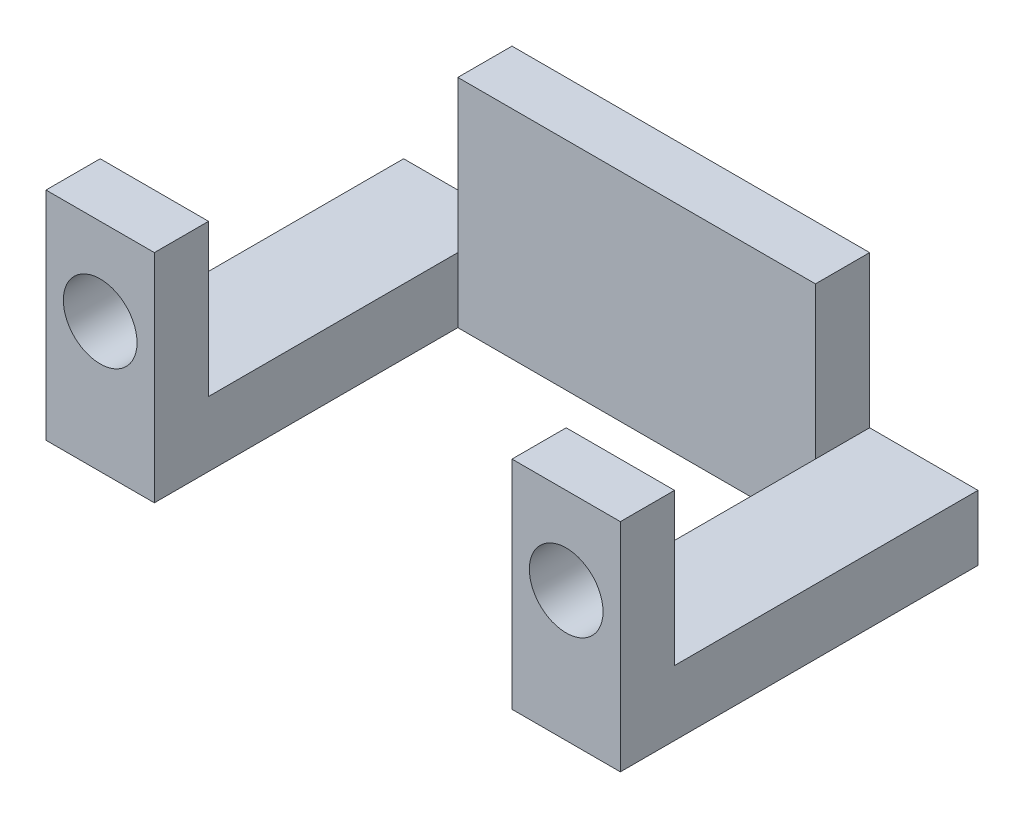
ISO-10303-21;
HEADER;
FILE_DESCRIPTION(('STEP AP214'),'2;1');
FILE_NAME('part.step','',(''),(''),'','','');
FILE_SCHEMA(('AUTOMOTIVE_DESIGN { 1 0 10303 214 1 1 1 1 }'));
ENDSEC;
DATA;
#1=APPLICATION_CONTEXT('core data for automotive mechanical design processes');
#2=APPLICATION_PROTOCOL_DEFINITION('international standard','automotive_design',2000,#1);
#3=PRODUCT_CONTEXT('',#1,'mechanical');
#4=PRODUCT('Part','Part','',(#3));
#5=PRODUCT_RELATED_PRODUCT_CATEGORY('part','',(#4));
#6=PRODUCT_DEFINITION_FORMATION('','',#4);
#7=PRODUCT_DEFINITION_CONTEXT('part definition',#1,'design');
#8=PRODUCT_DEFINITION('design','',#6,#7);
#9=PRODUCT_DEFINITION_SHAPE('','',#8);
#10=(LENGTH_UNIT() NAMED_UNIT(*) SI_UNIT(.MILLI.,.METRE.));
#11=(NAMED_UNIT(*) PLANE_ANGLE_UNIT() SI_UNIT($,.RADIAN.));
#12=(NAMED_UNIT(*) SI_UNIT($,.STERADIAN.) SOLID_ANGLE_UNIT());
#13=UNCERTAINTY_MEASURE_WITH_UNIT(LENGTH_MEASURE(1.E-05),#10,'distance_accuracy_value','');
#14=(GEOMETRIC_REPRESENTATION_CONTEXT(3) GLOBAL_UNCERTAINTY_ASSIGNED_CONTEXT((#13)) GLOBAL_UNIT_ASSIGNED_CONTEXT((#10,
#11,#12)) REPRESENTATION_CONTEXT('',''));
#15=CARTESIAN_POINT('',(0.,0.,0.));
#16=DIRECTION('',(0.,0.,1.));
#17=DIRECTION('',(1.,0.,0.));
#18=AXIS2_PLACEMENT_3D('',#15,#16,#17);
#19=CARTESIAN_POINT('',(0.,-360.42609669656,33.));
#20=DIRECTION('',(0.,1.,0.));
#21=DIRECTION('',(0.,0.,1.));
#22=AXIS2_PLACEMENT_3D('',#19,#20,#21);
#23=PLANE('',#22);
#24=DIRECTION('',(0.,0.,-1.));
#25=VECTOR('',#24,1.);
#26=CARTESIAN_POINT('',(-628.742256660427,-360.42609669656,33.));
#27=LINE('',#26,#25);
#28=CARTESIAN_POINT('',(-628.742256660427,-360.42609669656,28.));
#29=VERTEX_POINT('',#28);
#30=CARTESIAN_POINT('',(-628.742256660427,-360.42609669656,5.));
#31=VERTEX_POINT('',#30);
#32=EDGE_CURVE('E66',#29,#31,#27,.T.);
#33=ORIENTED_EDGE('',*,*,#32,.F.);
#34=DIRECTION('',(1.,0.,0.));
#35=VECTOR('',#34,1.);
#36=CARTESIAN_POINT('',(0.,-360.42609669656,28.));
#37=LINE('',#36,#35);
#38=CARTESIAN_POINT('',(-618.742256660427,-360.42609669656,28.));
#39=VERTEX_POINT('',#38);
#40=EDGE_CURVE('E70',#29,#39,#37,.T.);
#41=ORIENTED_EDGE('',*,*,#40,.T.);
#42=DIRECTION('',(0.,0.,-1.));
#43=VECTOR('',#42,1.);
#44=CARTESIAN_POINT('',(-618.742256660427,-360.42609669656,33.));
#45=LINE('',#44,#43);
#46=CARTESIAN_POINT('',(-618.742256660427,-360.42609669656,0.));
#47=VERTEX_POINT('',#46);
#48=EDGE_CURVE('E164',#39,#47,#45,.T.);
#49=ORIENTED_EDGE('',*,*,#48,.T.);
#50=DIRECTION('',(1.,0.,0.));
#51=VECTOR('',#50,1.);
#52=CARTESIAN_POINT('',(0.,-360.42609669656,0.));
#53=LINE('',#52,#51);
#54=CARTESIAN_POINT('',(-628.742256660427,-360.42609669656,0.));
#55=VERTEX_POINT('',#54);
#56=EDGE_CURVE('E253',#55,#47,#53,.T.);
#57=ORIENTED_EDGE('',*,*,#56,.F.);
#58=EDGE_CURVE('E57',#31,#55,#27,.T.);
#59=ORIENTED_EDGE('',*,*,#58,.F.);
#60=EDGE_LOOP('',(#33,#41,#49,#57,#59));
#61=FACE_BOUND('',#60,.T.);
#62=ADVANCED_FACE('F47',(#61),#23,.T.);
#63=CARTESIAN_POINT('',(0.,-360.42609669656,33.));
#64=DIRECTION('',(0.,1.,0.));
#65=DIRECTION('',(0.,0.,1.));
#66=AXIS2_PLACEMENT_3D('',#63,#64,#65);
#67=PLANE('',#66);
#68=DIRECTION('',(0.,0.,-1.));
#69=VECTOR('',#68,1.);
#70=CARTESIAN_POINT('',(-671.742256660427,-360.42609669656,33.));
#71=LINE('',#70,#69);
#72=CARTESIAN_POINT('',(-671.742256660427,-360.42609669656,28.));
#73=VERTEX_POINT('',#72);
#74=CARTESIAN_POINT('',(-671.742256660427,-360.42609669656,0.));
#75=VERTEX_POINT('',#74);
#76=EDGE_CURVE('E250',#73,#75,#71,.T.);
#77=ORIENTED_EDGE('',*,*,#76,.F.);
#78=DIRECTION('',(1.,0.,0.));
#79=VECTOR('',#78,1.);
#80=CARTESIAN_POINT('',(0.,-360.42609669656,28.));
#81=LINE('',#80,#79);
#82=CARTESIAN_POINT('',(-661.742256660427,-360.42609669656,28.));
#83=VERTEX_POINT('',#82);
#84=EDGE_CURVE('E198',#73,#83,#81,.T.);
#85=ORIENTED_EDGE('',*,*,#84,.T.);
#86=DIRECTION('',(0.,0.,-1.));
#87=VECTOR('',#86,1.);
#88=CARTESIAN_POINT('',(-661.742256660427,-360.42609669656,33.));
#89=LINE('',#88,#87);
#90=CARTESIAN_POINT('',(-661.742256660427,-360.42609669656,5.));
#91=VERTEX_POINT('',#90);
#92=EDGE_CURVE('E59',#83,#91,#89,.T.);
#93=ORIENTED_EDGE('',*,*,#92,.T.);
#94=CARTESIAN_POINT('',(-661.742256660427,-360.42609669656,0.));
#95=VERTEX_POINT('',#94);
#96=EDGE_CURVE('E11',#91,#95,#89,.T.);
#97=ORIENTED_EDGE('',*,*,#96,.T.);
#98=DIRECTION('',(1.,0.,0.));
#99=VECTOR('',#98,1.);
#100=CARTESIAN_POINT('',(0.,-360.42609669656,0.));
#101=LINE('',#100,#99);
#102=EDGE_CURVE('E220',#75,#95,#101,.T.);
#103=ORIENTED_EDGE('',*,*,#102,.F.);
#104=EDGE_LOOP('',(#77,#85,#93,#97,#103));
#105=FACE_BOUND('',#104,.T.);
#106=ADVANCED_FACE('F361',(#105),#67,.T.);
#107=CARTESIAN_POINT('',(-661.742256660427,0.,5.));
#108=DIRECTION('',(1.,0.,0.));
#109=DIRECTION('',(0.,0.,-1.));
#110=AXIS2_PLACEMENT_3D('',#107,#108,#109);
#111=PLANE('',#110);
#112=ORIENTED_EDGE('',*,*,#96,.F.);
#113=DIRECTION('',(0.,-1.,0.));
#114=VECTOR('',#113,1.);
#115=CARTESIAN_POINT('',(-661.742256660427,0.,5.));
#116=LINE('',#115,#114);
#117=CARTESIAN_POINT('',(-661.742256660427,-346.42609669656,5.));
#118=VERTEX_POINT('',#117);
#119=EDGE_CURVE('E293',#118,#91,#116,.T.);
#120=ORIENTED_EDGE('',*,*,#119,.F.);
#121=DIRECTION('',(0.,0.,-1.));
#122=VECTOR('',#121,1.);
#123=CARTESIAN_POINT('',(-661.742256660427,-346.42609669656,5.));
#124=LINE('',#123,#122);
#125=CARTESIAN_POINT('',(-661.742256660427,-346.42609669656,0.));
#126=VERTEX_POINT('',#125);
#127=EDGE_CURVE('E301',#118,#126,#124,.T.);
#128=ORIENTED_EDGE('',*,*,#127,.T.);
#129=DIRECTION('',(0.,-1.,0.));
#130=VECTOR('',#129,1.);
#131=CARTESIAN_POINT('',(-661.742256660427,0.,0.));
#132=LINE('',#131,#130);
#133=EDGE_CURVE('E309',#126,#95,#132,.T.);
#134=ORIENTED_EDGE('',*,*,#133,.T.);
#135=EDGE_LOOP('',(#112,#120,#128,#134));
#136=FACE_BOUND('',#135,.T.);
#137=ADVANCED_FACE('F332',(#136),#111,.F.);
#138=CARTESIAN_POINT('',(-628.742256660427,0.,5.));
#139=DIRECTION('',(1.,0.,0.));
#140=DIRECTION('',(0.,0.,-1.));
#141=AXIS2_PLACEMENT_3D('',#138,#139,#140);
#142=PLANE('',#141);
#143=DIRECTION('',(0.,-1.,0.));
#144=VECTOR('',#143,1.);
#145=CARTESIAN_POINT('',(-628.742256660427,0.,5.));
#146=LINE('',#145,#144);
#147=CARTESIAN_POINT('',(-628.742256660427,-346.42609669656,5.));
#148=VERTEX_POINT('',#147);
#149=EDGE_CURVE('E283',#148,#31,#146,.T.);
#150=ORIENTED_EDGE('',*,*,#149,.T.);
#151=ORIENTED_EDGE('',*,*,#58,.T.);
#152=DIRECTION('',(0.,-1.,0.));
#153=VECTOR('',#152,1.);
#154=CARTESIAN_POINT('',(-628.742256660427,0.,0.));
#155=LINE('',#154,#153);
#156=CARTESIAN_POINT('',(-628.742256660427,-346.42609669656,0.));
#157=VERTEX_POINT('',#156);
#158=EDGE_CURVE('E282',#157,#55,#155,.T.);
#159=ORIENTED_EDGE('',*,*,#158,.F.);
#160=DIRECTION('',(0.,0.,-1.));
#161=VECTOR('',#160,1.);
#162=CARTESIAN_POINT('',(-628.742256660427,-346.42609669656,5.));
#163=LINE('',#162,#161);
#164=EDGE_CURVE('E51',#148,#157,#163,.T.);
#165=ORIENTED_EDGE('',*,*,#164,.F.);
#166=EDGE_LOOP('',(#150,#151,#159,#165));
#167=FACE_BOUND('',#166,.T.);
#168=ADVANCED_FACE('F49',(#167),#142,.T.);
#169=CARTESIAN_POINT('',(0.,-346.42609669656,5.));
#170=DIRECTION('',(0.,1.,0.));
#171=DIRECTION('',(0.,0.,1.));
#172=AXIS2_PLACEMENT_3D('',#169,#170,#171);
#173=PLANE('',#172);
#174=DIRECTION('',(1.,0.,0.));
#175=VECTOR('',#174,1.);
#176=CARTESIAN_POINT('',(0.,-346.42609669656,0.));
#177=LINE('',#176,#175);
#178=EDGE_CURVE('E305',#126,#157,#177,.T.);
#179=ORIENTED_EDGE('',*,*,#178,.F.);
#180=ORIENTED_EDGE('',*,*,#127,.F.);
#181=DIRECTION('',(1.,0.,0.));
#182=VECTOR('',#181,1.);
#183=CARTESIAN_POINT('',(0.,-346.42609669656,5.));
#184=LINE('',#183,#182);
#185=EDGE_CURVE('E287',#118,#148,#184,.T.);
#186=ORIENTED_EDGE('',*,*,#185,.T.);
#187=ORIENTED_EDGE('',*,*,#164,.T.);
#188=EDGE_LOOP('',(#179,#180,#186,#187));
#189=FACE_BOUND('',#188,.T.);
#190=ADVANCED_FACE('F329',(#189),#173,.T.);
#191=CARTESIAN_POINT('',(3.83787442807588E-13,-366.426096696559,5.));
#192=DIRECTION('',(0.,1.,0.));
#193=DIRECTION('',(-1.,0.,0.));
#194=AXIS2_PLACEMENT_3D('',#191,#192,#193);
#195=PLANE('',#194);
#196=DIRECTION('',(1.,0.,0.));
#197=VECTOR('',#196,1.);
#198=CARTESIAN_POINT('',(3.83787442807588E-13,-366.426096696559,0.));
#199=LINE('',#198,#197);
#200=CARTESIAN_POINT('',(-671.742256660427,-366.42609669656,0.));
#201=VERTEX_POINT('',#200);
#202=CARTESIAN_POINT('',(-618.742256660427,-366.42609669656,0.));
#203=VERTEX_POINT('',#202);
#204=EDGE_CURVE('E312',#201,#203,#199,.T.);
#205=ORIENTED_EDGE('',*,*,#204,.T.);
#206=DIRECTION('',(0.,0.,-1.));
#207=VECTOR('',#206,1.);
#208=CARTESIAN_POINT('',(-618.742256660427,-366.42609669656,33.));
#209=LINE('',#208,#207);
#210=CARTESIAN_POINT('',(-618.742256660427,-366.42609669656,33.));
#211=VERTEX_POINT('',#210);
#212=EDGE_CURVE('E272',#211,#203,#209,.T.);
#213=ORIENTED_EDGE('',*,*,#212,.F.);
#214=DIRECTION('',(1.,0.,0.));
#215=VECTOR('',#214,1.);
#216=CARTESIAN_POINT('',(3.83787442807588E-13,-366.426096696559,33.));
#217=LINE('',#216,#215);
#218=CARTESIAN_POINT('',(-628.742256660427,-366.42609669656,33.));
#219=VERTEX_POINT('',#218);
#220=EDGE_CURVE('E257',#219,#211,#217,.T.);
#221=ORIENTED_EDGE('',*,*,#220,.F.);
#222=DIRECTION('',(0.,0.,-1.));
#223=VECTOR('',#222,1.);
#224=CARTESIAN_POINT('',(-628.742256660427,-366.42609669656,33.));
#225=LINE('',#224,#223);
#226=CARTESIAN_POINT('',(-628.742256660427,-366.42609669656,5.));
#227=VERTEX_POINT('',#226);
#228=EDGE_CURVE('E276',#219,#227,#225,.T.);
#229=ORIENTED_EDGE('',*,*,#228,.T.);
#230=DIRECTION('',(1.,0.,0.));
#231=VECTOR('',#230,1.);
#232=CARTESIAN_POINT('',(3.83787442807588E-13,-366.426096696559,5.));
#233=LINE('',#232,#231);
#234=CARTESIAN_POINT('',(-661.742256660427,-366.42609669656,5.));
#235=VERTEX_POINT('',#234);
#236=EDGE_CURVE('E297',#235,#227,#233,.T.);
#237=ORIENTED_EDGE('',*,*,#236,.F.);
#238=DIRECTION('',(0.,0.,-1.));
#239=VECTOR('',#238,1.);
#240=CARTESIAN_POINT('',(-661.742256660427,-366.42609669656,33.));
#241=LINE('',#240,#239);
#242=CARTESIAN_POINT('',(-661.742256660427,-366.42609669656,33.));
#243=VERTEX_POINT('',#242);
#244=EDGE_CURVE('E242',#243,#235,#241,.T.);
#245=ORIENTED_EDGE('',*,*,#244,.F.);
#246=DIRECTION('',(1.,0.,0.));
#247=VECTOR('',#246,1.);
#248=CARTESIAN_POINT('',(3.83787442807588E-13,-366.426096696559,33.));
#249=LINE('',#248,#247);
#250=CARTESIAN_POINT('',(-671.742256660427,-366.42609669656,33.));
#251=VERTEX_POINT('',#250);
#252=EDGE_CURVE('E227',#251,#243,#249,.T.);
#253=ORIENTED_EDGE('',*,*,#252,.F.);
#254=DIRECTION('',(0.,0.,-1.));
#255=VECTOR('',#254,1.);
#256=CARTESIAN_POINT('',(-671.742256660427,-366.42609669656,33.));
#257=LINE('',#256,#255);
#258=EDGE_CURVE('E246',#251,#201,#257,.T.);
#259=ORIENTED_EDGE('',*,*,#258,.T.);
#260=EDGE_LOOP('',(#205,#213,#221,#229,#237,#245,#253,#259));
#261=FACE_BOUND('',#260,.T.);
#262=ADVANCED_FACE('F345',(#261),#195,.F.);
#263=CARTESIAN_POINT('',(0.,0.,5.));
#264=DIRECTION('',(0.,0.,1.));
#265=DIRECTION('',(1.,0.,0.));
#266=AXIS2_PLACEMENT_3D('',#263,#264,#265);
#267=PLANE('',#266);
#268=ORIENTED_EDGE('',*,*,#149,.F.);
#269=ORIENTED_EDGE('',*,*,#185,.F.);
#270=ORIENTED_EDGE('',*,*,#119,.T.);
#271=EDGE_CURVE('E292',#91,#235,#116,.T.);
#272=ORIENTED_EDGE('',*,*,#271,.T.);
#273=ORIENTED_EDGE('',*,*,#236,.T.);
#274=EDGE_CURVE('E288',#31,#227,#146,.T.);
#275=ORIENTED_EDGE('',*,*,#274,.F.);
#276=EDGE_LOOP('',(#268,#269,#270,#272,#273,#275));
#277=FACE_BOUND('',#276,.T.);
#278=ADVANCED_FACE('F335',(#277),#267,.T.);
#279=CARTESIAN_POINT('',(0.,0.,0.));
#280=DIRECTION('',(0.,0.,1.));
#281=DIRECTION('',(1.,0.,0.));
#282=AXIS2_PLACEMENT_3D('',#279,#280,#281);
#283=PLANE('',#282);
#284=ORIENTED_EDGE('',*,*,#158,.T.);
#285=ORIENTED_EDGE('',*,*,#56,.T.);
#286=DIRECTION('',(0.,-1.,0.));
#287=VECTOR('',#286,1.);
#288=CARTESIAN_POINT('',(-618.742256660427,0.,0.));
#289=LINE('',#288,#287);
#290=EDGE_CURVE('E258',#47,#203,#289,.T.);
#291=ORIENTED_EDGE('',*,*,#290,.T.);
#292=ORIENTED_EDGE('',*,*,#204,.F.);
#293=DIRECTION('',(0.,-1.,0.));
#294=VECTOR('',#293,1.);
#295=CARTESIAN_POINT('',(-671.742256660427,0.,0.));
#296=LINE('',#295,#294);
#297=EDGE_CURVE('E228',#75,#201,#296,.T.);
#298=ORIENTED_EDGE('',*,*,#297,.F.);
#299=ORIENTED_EDGE('',*,*,#102,.T.);
#300=ORIENTED_EDGE('',*,*,#133,.F.);
#301=ORIENTED_EDGE('',*,*,#178,.T.);
#302=EDGE_LOOP('',(#284,#285,#291,#292,#298,#299,#300,#301));
#303=FACE_BOUND('',#302,.T.);
#304=ADVANCED_FACE('F328',(#303),#283,.F.);
#305=CARTESIAN_POINT('',(-628.742256660427,0.,33.));
#306=DIRECTION('',(1.,0.,0.));
#307=DIRECTION('',(0.,0.,-1.));
#308=AXIS2_PLACEMENT_3D('',#305,#306,#307);
#309=PLANE('',#308);
#310=DIRECTION('',(0.,-1.,0.));
#311=VECTOR('',#310,1.);
#312=CARTESIAN_POINT('',(-628.742256660427,0.,33.));
#313=LINE('',#312,#311);
#314=CARTESIAN_POINT('',(-628.742256660427,-346.42609669656,33.));
#315=VERTEX_POINT('',#314);
#316=EDGE_CURVE('E254',#315,#219,#313,.T.);
#317=ORIENTED_EDGE('',*,*,#316,.F.);
#318=DIRECTION('',(0.,0.,1.));
#319=VECTOR('',#318,1.);
#320=CARTESIAN_POINT('',(-628.742256660427,-346.42609669656,28.));
#321=LINE('',#320,#319);
#322=CARTESIAN_POINT('',(-628.742256660427,-346.42609669656,28.));
#323=VERTEX_POINT('',#322);
#324=EDGE_CURVE('E182',#323,#315,#321,.T.);
#325=ORIENTED_EDGE('',*,*,#324,.F.);
#326=DIRECTION('',(0.,-1.,0.));
#327=VECTOR('',#326,1.);
#328=CARTESIAN_POINT('',(-628.742256660427,0.,28.));
#329=LINE('',#328,#327);
#330=EDGE_CURVE('E173',#323,#29,#329,.T.);
#331=ORIENTED_EDGE('',*,*,#330,.T.);
#332=ORIENTED_EDGE('',*,*,#32,.T.);
#333=ORIENTED_EDGE('',*,*,#274,.T.);
#334=ORIENTED_EDGE('',*,*,#228,.F.);
#335=EDGE_LOOP('',(#317,#325,#331,#332,#333,#334));
#336=FACE_BOUND('',#335,.T.);
#337=ADVANCED_FACE('F388',(#336),#309,.F.);
#338=CARTESIAN_POINT('',(-618.742256660427,0.,33.));
#339=DIRECTION('',(1.,0.,0.));
#340=DIRECTION('',(0.,0.,-1.));
#341=AXIS2_PLACEMENT_3D('',#338,#339,#340);
#342=PLANE('',#341);
#343=ORIENTED_EDGE('',*,*,#290,.F.);
#344=ORIENTED_EDGE('',*,*,#48,.F.);
#345=DIRECTION('',(0.,-1.,0.));
#346=VECTOR('',#345,1.);
#347=CARTESIAN_POINT('',(-618.742256660427,0.,28.));
#348=LINE('',#347,#346);
#349=CARTESIAN_POINT('',(-618.742256660427,-346.42609669656,28.));
#350=VERTEX_POINT('',#349);
#351=EDGE_CURVE('E156',#350,#39,#348,.T.);
#352=ORIENTED_EDGE('',*,*,#351,.F.);
#353=DIRECTION('',(0.,0.,1.));
#354=VECTOR('',#353,1.);
#355=CARTESIAN_POINT('',(-618.742256660427,-346.42609669656,28.));
#356=LINE('',#355,#354);
#357=CARTESIAN_POINT('',(-618.742256660427,-346.42609669656,33.));
#358=VERTEX_POINT('',#357);
#359=EDGE_CURVE('E162',#350,#358,#356,.T.);
#360=ORIENTED_EDGE('',*,*,#359,.T.);
#361=DIRECTION('',(0.,-1.,0.));
#362=VECTOR('',#361,1.);
#363=CARTESIAN_POINT('',(-618.742256660427,0.,33.));
#364=LINE('',#363,#362);
#365=EDGE_CURVE('E261',#358,#211,#364,.T.);
#366=ORIENTED_EDGE('',*,*,#365,.T.);
#367=ORIENTED_EDGE('',*,*,#212,.T.);
#368=EDGE_LOOP('',(#343,#344,#352,#360,#366,#367));
#369=FACE_BOUND('',#368,.T.);
#370=ADVANCED_FACE('F159',(#369),#342,.T.);
#371=CARTESIAN_POINT('',(0.,0.,33.));
#372=DIRECTION('',(0.,0.,1.));
#373=DIRECTION('',(1.,0.,0.));
#374=AXIS2_PLACEMENT_3D('',#371,#372,#373);
#375=PLANE('',#374);
#376=ORIENTED_EDGE('',*,*,#365,.F.);
#377=DIRECTION('',(1.,0.,0.));
#378=VECTOR('',#377,1.);
#379=CARTESIAN_POINT('',(0.,-346.42609669656,33.));
#380=LINE('',#379,#378);
#381=EDGE_CURVE('E180',#315,#358,#380,.T.);
#382=ORIENTED_EDGE('',*,*,#381,.F.);
#383=ORIENTED_EDGE('',*,*,#316,.T.);
#384=ORIENTED_EDGE('',*,*,#220,.T.);
#385=EDGE_LOOP('',(#376,#382,#383,#384));
#386=FACE_BOUND('',#385,.T.);
#387=CARTESIAN_POINT('',(-623.742256660427,-354.42609669656,33.));
#388=DIRECTION('',(0.,0.,1.));
#389=DIRECTION('',(1.,0.,0.));
#390=AXIS2_PLACEMENT_3D('',#387,#388,#389);
#391=CIRCLE('',#390,3.39999999999992);
#392=CARTESIAN_POINT('',(-620.342256660427,-354.42609669656,33.));
#393=VERTEX_POINT('',#392);
#394=EDGE_CURVE('E654',#393,#393,#391,.T.);
#395=ORIENTED_EDGE('',*,*,#394,.F.);
#396=EDGE_LOOP('',(#395));
#397=FACE_BOUND('',#396,.T.);
#398=ADVANCED_FACE('F495',(#386,#397),#375,.T.);
#399=CARTESIAN_POINT('',(-661.742256660427,0.,33.));
#400=DIRECTION('',(1.,0.,0.));
#401=DIRECTION('',(0.,0.,-1.));
#402=AXIS2_PLACEMENT_3D('',#399,#400,#401);
#403=PLANE('',#402);
#404=ORIENTED_EDGE('',*,*,#271,.F.);
#405=ORIENTED_EDGE('',*,*,#92,.F.);
#406=DIRECTION('',(0.,-1.,0.));
#407=VECTOR('',#406,1.);
#408=CARTESIAN_POINT('',(-661.742256660427,0.,28.));
#409=LINE('',#408,#407);
#410=CARTESIAN_POINT('',(-661.742256660427,-346.42609669656,28.));
#411=VERTEX_POINT('',#410);
#412=EDGE_CURVE('E201',#411,#83,#409,.T.);
#413=ORIENTED_EDGE('',*,*,#412,.F.);
#414=DIRECTION('',(0.,0.,1.));
#415=VECTOR('',#414,1.);
#416=CARTESIAN_POINT('',(-661.742256660427,-346.42609669656,28.));
#417=LINE('',#416,#415);
#418=CARTESIAN_POINT('',(-661.742256660427,-346.42609669656,33.));
#419=VERTEX_POINT('',#418);
#420=EDGE_CURVE('E209',#411,#419,#417,.T.);
#421=ORIENTED_EDGE('',*,*,#420,.T.);
#422=DIRECTION('',(0.,-1.,0.));
#423=VECTOR('',#422,1.);
#424=CARTESIAN_POINT('',(-661.742256660427,0.,33.));
#425=LINE('',#424,#423);
#426=EDGE_CURVE('E231',#419,#243,#425,.T.);
#427=ORIENTED_EDGE('',*,*,#426,.T.);
#428=ORIENTED_EDGE('',*,*,#244,.T.);
#429=EDGE_LOOP('',(#404,#405,#413,#421,#427,#428));
#430=FACE_BOUND('',#429,.T.);
#431=ADVANCED_FACE('F348',(#430),#403,.T.);
#432=CARTESIAN_POINT('',(-671.742256660427,0.,33.));
#433=DIRECTION('',(1.,0.,0.));
#434=DIRECTION('',(0.,0.,-1.));
#435=AXIS2_PLACEMENT_3D('',#432,#433,#434);
#436=PLANE('',#435);
#437=ORIENTED_EDGE('',*,*,#297,.T.);
#438=ORIENTED_EDGE('',*,*,#258,.F.);
#439=DIRECTION('',(0.,-1.,0.));
#440=VECTOR('',#439,1.);
#441=CARTESIAN_POINT('',(-671.742256660427,0.,33.));
#442=LINE('',#441,#440);
#443=CARTESIAN_POINT('',(-671.742256660427,-346.42609669656,33.));
#444=VERTEX_POINT('',#443);
#445=EDGE_CURVE('E224',#444,#251,#442,.T.);
#446=ORIENTED_EDGE('',*,*,#445,.F.);
#447=DIRECTION('',(0.,0.,1.));
#448=VECTOR('',#447,1.);
#449=CARTESIAN_POINT('',(-671.742256660427,-346.42609669656,28.));
#450=LINE('',#449,#448);
#451=CARTESIAN_POINT('',(-671.742256660427,-346.42609669656,28.));
#452=VERTEX_POINT('',#451);
#453=EDGE_CURVE('E216',#452,#444,#450,.T.);
#454=ORIENTED_EDGE('',*,*,#453,.F.);
#455=DIRECTION('',(0.,-1.,0.));
#456=VECTOR('',#455,1.);
#457=CARTESIAN_POINT('',(-671.742256660427,0.,28.));
#458=LINE('',#457,#456);
#459=EDGE_CURVE('E193',#452,#73,#458,.T.);
#460=ORIENTED_EDGE('',*,*,#459,.T.);
#461=ORIENTED_EDGE('',*,*,#76,.T.);
#462=EDGE_LOOP('',(#437,#438,#446,#454,#460,#461));
#463=FACE_BOUND('',#462,.T.);
#464=ADVANCED_FACE('F357',(#463),#436,.F.);
#465=CARTESIAN_POINT('',(0.,0.,33.));
#466=DIRECTION('',(0.,0.,1.));
#467=DIRECTION('',(1.,0.,0.));
#468=AXIS2_PLACEMENT_3D('',#465,#466,#467);
#469=PLANE('',#468);
#470=ORIENTED_EDGE('',*,*,#426,.F.);
#471=DIRECTION('',(1.,0.,0.));
#472=VECTOR('',#471,1.);
#473=CARTESIAN_POINT('',(0.,-346.42609669656,33.));
#474=LINE('',#473,#472);
#475=EDGE_CURVE('E194',#444,#419,#474,.T.);
#476=ORIENTED_EDGE('',*,*,#475,.F.);
#477=ORIENTED_EDGE('',*,*,#445,.T.);
#478=ORIENTED_EDGE('',*,*,#252,.T.);
#479=EDGE_LOOP('',(#470,#476,#477,#478));
#480=FACE_BOUND('',#479,.T.);
#481=CARTESIAN_POINT('',(-666.742256660427,-354.42609669656,33.));
#482=DIRECTION('',(0.,0.,1.));
#483=DIRECTION('',(1.,0.,0.));
#484=AXIS2_PLACEMENT_3D('',#481,#482,#483);
#485=CIRCLE('',#484,3.39999999999992);
#486=CARTESIAN_POINT('',(-663.342256660427,-354.42609669656,33.));
#487=VERTEX_POINT('',#486);
#488=EDGE_CURVE('E185',#487,#487,#485,.T.);
#489=ORIENTED_EDGE('',*,*,#488,.F.);
#490=EDGE_LOOP('',(#489));
#491=FACE_BOUND('',#490,.T.);
#492=ADVANCED_FACE('F352',(#480,#491),#469,.T.);
#493=CARTESIAN_POINT('',(0.,-346.42609669656,28.));
#494=DIRECTION('',(0.,-1.,0.));
#495=DIRECTION('',(0.,0.,-1.));
#496=AXIS2_PLACEMENT_3D('',#493,#494,#495);
#497=PLANE('',#496);
#498=ORIENTED_EDGE('',*,*,#475,.T.);
#499=ORIENTED_EDGE('',*,*,#420,.F.);
#500=DIRECTION('',(1.,0.,0.));
#501=VECTOR('',#500,1.);
#502=CARTESIAN_POINT('',(0.,-346.42609669656,28.));
#503=LINE('',#502,#501);
#504=EDGE_CURVE('E205',#452,#411,#503,.T.);
#505=ORIENTED_EDGE('',*,*,#504,.F.);
#506=ORIENTED_EDGE('',*,*,#453,.T.);
#507=EDGE_LOOP('',(#498,#499,#505,#506));
#508=FACE_BOUND('',#507,.T.);
#509=ADVANCED_FACE('F368',(#508),#497,.F.);
#510=CARTESIAN_POINT('',(-666.742256660427,-354.42609669656,28.));
#511=DIRECTION('',(0.,0.,1.));
#512=DIRECTION('',(1.,0.,0.));
#513=AXIS2_PLACEMENT_3D('',#510,#511,#512);
#514=CYLINDRICAL_SURFACE('',#513,3.39999999999992);
#515=CARTESIAN_POINT('',(-666.742256660427,-354.42609669656,28.));
#516=DIRECTION('',(0.,0.,1.));
#517=DIRECTION('',(1.,0.,0.));
#518=AXIS2_PLACEMENT_3D('',#515,#516,#517);
#519=CIRCLE('',#518,3.39999999999992);
#520=CARTESIAN_POINT('',(-663.342256660427,-354.42609669656,28.));
#521=VERTEX_POINT('',#520);
#522=EDGE_CURVE('E189',#521,#521,#519,.T.);
#523=ORIENTED_EDGE('',*,*,#522,.F.);
#524=EDGE_LOOP('',(#523));
#525=FACE_BOUND('',#524,.T.);
#526=ORIENTED_EDGE('',*,*,#488,.T.);
#527=EDGE_LOOP('',(#526));
#528=FACE_BOUND('',#527,.T.);
#529=ADVANCED_FACE('F370',(#525,#528),#514,.F.);
#530=CARTESIAN_POINT('',(0.,0.,28.));
#531=DIRECTION('',(0.,0.,1.));
#532=DIRECTION('',(1.,0.,0.));
#533=AXIS2_PLACEMENT_3D('',#530,#531,#532);
#534=PLANE('',#533);
#535=ORIENTED_EDGE('',*,*,#522,.T.);
#536=EDGE_LOOP('',(#535));
#537=FACE_BOUND('',#536,.T.);
#538=ORIENTED_EDGE('',*,*,#459,.F.);
#539=ORIENTED_EDGE('',*,*,#504,.T.);
#540=ORIENTED_EDGE('',*,*,#412,.T.);
#541=ORIENTED_EDGE('',*,*,#84,.F.);
#542=EDGE_LOOP('',(#538,#539,#540,#541));
#543=FACE_BOUND('',#542,.T.);
#544=ADVANCED_FACE('F365',(#537,#543),#534,.F.);
#545=CARTESIAN_POINT('',(0.,-346.42609669656,28.));
#546=DIRECTION('',(0.,-1.,0.));
#547=DIRECTION('',(0.,0.,-1.));
#548=AXIS2_PLACEMENT_3D('',#545,#546,#547);
#549=PLANE('',#548);
#550=ORIENTED_EDGE('',*,*,#381,.T.);
#551=ORIENTED_EDGE('',*,*,#359,.F.);
#552=DIRECTION('',(1.,0.,0.));
#553=VECTOR('',#552,1.);
#554=CARTESIAN_POINT('',(0.,-346.42609669656,28.));
#555=LINE('',#554,#553);
#556=EDGE_CURVE('E167',#323,#350,#555,.T.);
#557=ORIENTED_EDGE('',*,*,#556,.F.);
#558=ORIENTED_EDGE('',*,*,#324,.T.);
#559=EDGE_LOOP('',(#550,#551,#557,#558));
#560=FACE_BOUND('',#559,.T.);
#561=ADVANCED_FACE('F178',(#560),#549,.F.);
#562=CARTESIAN_POINT('',(-623.742256660427,-354.42609669656,28.));
#563=DIRECTION('',(0.,0.,1.));
#564=DIRECTION('',(1.,0.,0.));
#565=AXIS2_PLACEMENT_3D('',#562,#563,#564);
#566=CYLINDRICAL_SURFACE('',#565,3.39999999999992);
#567=CARTESIAN_POINT('',(-623.742256660427,-354.42609669656,28.));
#568=DIRECTION('',(0.,0.,1.));
#569=DIRECTION('',(1.,0.,0.));
#570=AXIS2_PLACEMENT_3D('',#567,#568,#569);
#571=CIRCLE('',#570,3.39999999999992);
#572=CARTESIAN_POINT('',(-620.342256660427,-354.42609669656,28.));
#573=VERTEX_POINT('',#572);
#574=EDGE_CURVE('E648',#573,#573,#571,.T.);
#575=ORIENTED_EDGE('',*,*,#574,.F.);
#576=EDGE_LOOP('',(#575));
#577=FACE_BOUND('',#576,.T.);
#578=ORIENTED_EDGE('',*,*,#394,.T.);
#579=EDGE_LOOP('',(#578));
#580=FACE_BOUND('',#579,.T.);
#581=ADVANCED_FACE('F594',(#577,#580),#566,.F.);
#582=CARTESIAN_POINT('',(0.,0.,28.));
#583=DIRECTION('',(0.,0.,1.));
#584=DIRECTION('',(1.,0.,0.));
#585=AXIS2_PLACEMENT_3D('',#582,#583,#584);
#586=PLANE('',#585);
#587=ORIENTED_EDGE('',*,*,#574,.T.);
#588=EDGE_LOOP('',(#587));
#589=FACE_BOUND('',#588,.T.);
#590=ORIENTED_EDGE('',*,*,#330,.F.);
#591=ORIENTED_EDGE('',*,*,#556,.T.);
#592=ORIENTED_EDGE('',*,*,#351,.T.);
#593=ORIENTED_EDGE('',*,*,#40,.F.);
#594=EDGE_LOOP('',(#590,#591,#592,#593));
#595=FACE_BOUND('',#594,.T.);
#596=ADVANCED_FACE('F171',(#589,#595),#586,.F.);
#597=CLOSED_SHELL('',(#62,#106,#137,#168,#190,#262,#278,#304,#337,#370,#398,#431,#464,#492,#509,
#529,#544,#561,#581,#596));
#598=MANIFOLD_SOLID_BREP('B2',#597);
#599=ADVANCED_BREP_SHAPE_REPRESENTATION('',(#18,#598),#14);
#600=SHAPE_DEFINITION_REPRESENTATION(#9,#599);
ENDSEC;
END-ISO-10303-21;
